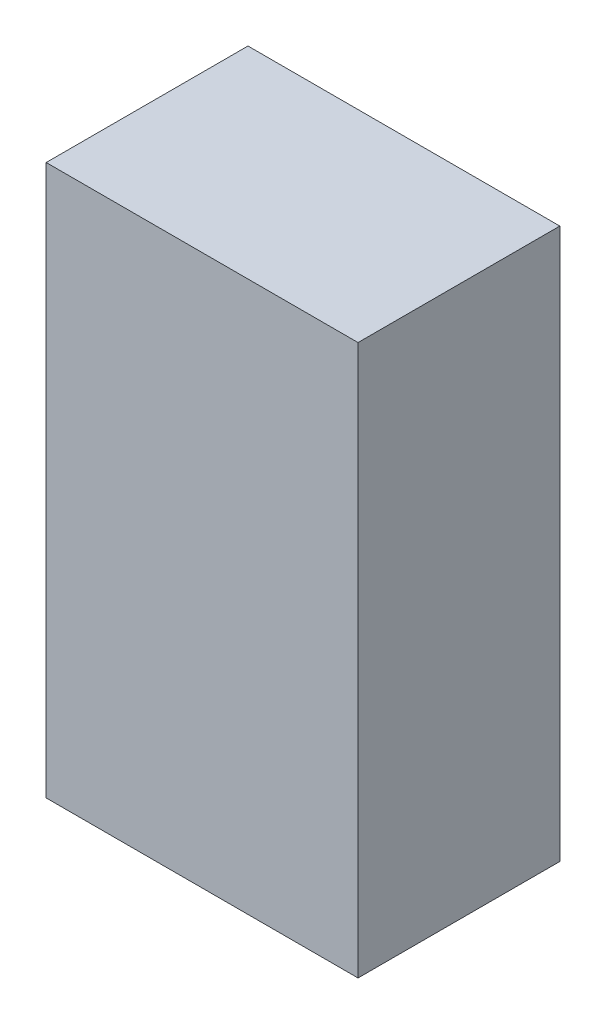
ISO-10303-21;
HEADER;
FILE_DESCRIPTION(('STEP AP214'),'2;1');
FILE_NAME('part.step','',(''),(''),'','','');
FILE_SCHEMA(('AUTOMOTIVE_DESIGN { 1 0 10303 214 1 1 1 1 }'));
ENDSEC;
DATA;
#1=APPLICATION_CONTEXT('core data for automotive mechanical design processes');
#2=APPLICATION_PROTOCOL_DEFINITION('international standard','automotive_design',2000,#1);
#3=PRODUCT_CONTEXT('',#1,'mechanical');
#4=PRODUCT('Part','Part','',(#3));
#5=PRODUCT_RELATED_PRODUCT_CATEGORY('part','',(#4));
#6=PRODUCT_DEFINITION_FORMATION('','',#4);
#7=PRODUCT_DEFINITION_CONTEXT('part definition',#1,'design');
#8=PRODUCT_DEFINITION('design','',#6,#7);
#9=PRODUCT_DEFINITION_SHAPE('','',#8);
#10=(LENGTH_UNIT() NAMED_UNIT(*) SI_UNIT(.MILLI.,.METRE.));
#11=(NAMED_UNIT(*) PLANE_ANGLE_UNIT() SI_UNIT($,.RADIAN.));
#12=(NAMED_UNIT(*) SI_UNIT($,.STERADIAN.) SOLID_ANGLE_UNIT());
#13=UNCERTAINTY_MEASURE_WITH_UNIT(LENGTH_MEASURE(1.E-05),#10,'distance_accuracy_value','');
#14=(GEOMETRIC_REPRESENTATION_CONTEXT(3) GLOBAL_UNCERTAINTY_ASSIGNED_CONTEXT((#13)) GLOBAL_UNIT_ASSIGNED_CONTEXT((#10,
#11,#12)) REPRESENTATION_CONTEXT('',''));
#15=CARTESIAN_POINT('',(0.,0.,0.));
#16=DIRECTION('',(0.,0.,1.));
#17=DIRECTION('',(1.,0.,0.));
#18=AXIS2_PLACEMENT_3D('',#15,#16,#17);
#19=CARTESIAN_POINT('',(0.85000084,-1.49999954,1.1));
#20=DIRECTION('',(0.,0.,1.));
#21=DIRECTION('',(1.,0.,0.));
#22=AXIS2_PLACEMENT_3D('',#19,#20,#21);
#23=PLANE('',#22);
#24=DIRECTION('',(1.,0.,0.));
#25=VECTOR('',#24,1.);
#26=CARTESIAN_POINT('',(-0.85000084,1.49999954,1.1));
#27=LINE('',#26,#25);
#28=CARTESIAN_POINT('',(-0.85000084,1.49999954,1.1));
#29=VERTEX_POINT('',#28);
#30=CARTESIAN_POINT('',(0.85000084,1.49999954,1.1));
#31=VERTEX_POINT('',#30);
#32=EDGE_CURVE('E58',#29,#31,#27,.T.);
#33=ORIENTED_EDGE('',*,*,#32,.F.);
#34=DIRECTION('',(0.,1.,0.));
#35=VECTOR('',#34,1.);
#36=CARTESIAN_POINT('',(-0.85000084,-1.49999954,1.1));
#37=LINE('',#36,#35);
#38=CARTESIAN_POINT('',(-0.85000084,-1.49999954,1.1));
#39=VERTEX_POINT('',#38);
#40=EDGE_CURVE('E53',#39,#29,#37,.T.);
#41=ORIENTED_EDGE('',*,*,#40,.F.);
#42=DIRECTION('',(1.,0.,0.));
#43=VECTOR('',#42,1.);
#44=CARTESIAN_POINT('',(0.85000084,-1.49999954,1.1));
#45=LINE('',#44,#43);
#46=CARTESIAN_POINT('',(0.85000084,-1.49999954,1.1));
#47=VERTEX_POINT('',#46);
#48=EDGE_CURVE('E20',#39,#47,#45,.T.);
#49=ORIENTED_EDGE('',*,*,#48,.T.);
#50=DIRECTION('',(0.,1.,0.));
#51=VECTOR('',#50,1.);
#52=CARTESIAN_POINT('',(0.85000084,1.49999954,1.1));
#53=LINE('',#52,#51);
#54=EDGE_CURVE('E67',#31,#47,#53,.F.);
#55=ORIENTED_EDGE('',*,*,#54,.F.);
#56=EDGE_LOOP('',(#33,#41,#49,#55));
#57=FACE_BOUND('',#56,.T.);
#58=ADVANCED_FACE('F17',(#57),#23,.T.);
#59=CARTESIAN_POINT('',(0.85000084,1.49999954,0.));
#60=DIRECTION('',(1.,0.,0.));
#61=DIRECTION('',(0.,0.,-1.));
#62=AXIS2_PLACEMENT_3D('',#59,#60,#61);
#63=PLANE('',#62);
#64=DIRECTION('',(0.,0.,-1.));
#65=VECTOR('',#64,1.);
#66=CARTESIAN_POINT('',(0.85000084,-1.49999954,0.));
#67=LINE('',#66,#65);
#68=CARTESIAN_POINT('',(0.85000084,-1.49999954,0.));
#69=VERTEX_POINT('',#68);
#70=EDGE_CURVE('E80',#69,#47,#67,.F.);
#71=ORIENTED_EDGE('',*,*,#70,.F.);
#72=DIRECTION('',(0.,1.,0.));
#73=VECTOR('',#72,1.);
#74=CARTESIAN_POINT('',(0.85000084,-1.49999954,0.));
#75=LINE('',#74,#73);
#76=CARTESIAN_POINT('',(0.85000084,1.49999954,0.));
#77=VERTEX_POINT('',#76);
#78=EDGE_CURVE('E75',#69,#77,#75,.T.);
#79=ORIENTED_EDGE('',*,*,#78,.T.);
#80=DIRECTION('',(0.,0.,1.));
#81=VECTOR('',#80,1.);
#82=CARTESIAN_POINT('',(0.85000084,1.49999954,0.));
#83=LINE('',#82,#81);
#84=EDGE_CURVE('E63',#31,#77,#83,.F.);
#85=ORIENTED_EDGE('',*,*,#84,.F.);
#86=ORIENTED_EDGE('',*,*,#54,.T.);
#87=EDGE_LOOP('',(#71,#79,#85,#86));
#88=FACE_BOUND('',#87,.T.);
#89=ADVANCED_FACE('F74',(#88),#63,.T.);
#90=CARTESIAN_POINT('',(-0.85000084,1.49999954,0.));
#91=DIRECTION('',(0.,1.,0.));
#92=DIRECTION('',(0.,0.,1.));
#93=AXIS2_PLACEMENT_3D('',#90,#91,#92);
#94=PLANE('',#93);
#95=ORIENTED_EDGE('',*,*,#84,.T.);
#96=DIRECTION('',(1.,0.,0.));
#97=VECTOR('',#96,1.);
#98=CARTESIAN_POINT('',(0.85000084,1.49999954,0.));
#99=LINE('',#98,#97);
#100=CARTESIAN_POINT('',(-0.85000084,1.49999954,0.));
#101=VERTEX_POINT('',#100);
#102=EDGE_CURVE('E84',#77,#101,#99,.F.);
#103=ORIENTED_EDGE('',*,*,#102,.T.);
#104=DIRECTION('',(0.,0.,1.));
#105=VECTOR('',#104,1.);
#106=CARTESIAN_POINT('',(-0.85000084,1.49999954,0.));
#107=LINE('',#106,#105);
#108=EDGE_CURVE('E65',#29,#101,#107,.F.);
#109=ORIENTED_EDGE('',*,*,#108,.F.);
#110=ORIENTED_EDGE('',*,*,#32,.T.);
#111=EDGE_LOOP('',(#95,#103,#109,#110));
#112=FACE_BOUND('',#111,.T.);
#113=ADVANCED_FACE('F60',(#112),#94,.T.);
#114=CARTESIAN_POINT('',(-0.85000084,-1.49999954,0.));
#115=DIRECTION('',(-1.,0.,0.));
#116=DIRECTION('',(0.,0.,1.));
#117=AXIS2_PLACEMENT_3D('',#114,#115,#116);
#118=PLANE('',#117);
#119=ORIENTED_EDGE('',*,*,#108,.T.);
#120=DIRECTION('',(0.,1.,0.));
#121=VECTOR('',#120,1.);
#122=CARTESIAN_POINT('',(-0.85000084,-1.49999954,0.));
#123=LINE('',#122,#121);
#124=CARTESIAN_POINT('',(-0.85000084,-1.49999954,0.));
#125=VERTEX_POINT('',#124);
#126=EDGE_CURVE('E26',#101,#125,#123,.F.);
#127=ORIENTED_EDGE('',*,*,#126,.T.);
#128=DIRECTION('',(0.,0.,-1.));
#129=VECTOR('',#128,1.);
#130=CARTESIAN_POINT('',(-0.85000084,-1.49999954,0.));
#131=LINE('',#130,#129);
#132=EDGE_CURVE('E34',#39,#125,#131,.T.);
#133=ORIENTED_EDGE('',*,*,#132,.F.);
#134=ORIENTED_EDGE('',*,*,#40,.T.);
#135=EDGE_LOOP('',(#119,#127,#133,#134));
#136=FACE_BOUND('',#135,.T.);
#137=ADVANCED_FACE('F88',(#136),#118,.T.);
#138=CARTESIAN_POINT('',(0.85000084,-1.49999954,0.));
#139=DIRECTION('',(0.,-1.,0.));
#140=DIRECTION('',(0.,0.,-1.));
#141=AXIS2_PLACEMENT_3D('',#138,#139,#140);
#142=PLANE('',#141);
#143=ORIENTED_EDGE('',*,*,#132,.T.);
#144=DIRECTION('',(1.,0.,0.));
#145=VECTOR('',#144,1.);
#146=CARTESIAN_POINT('',(0.85000084,-1.49999954,0.));
#147=LINE('',#146,#145);
#148=EDGE_CURVE('E11',#125,#69,#147,.T.);
#149=ORIENTED_EDGE('',*,*,#148,.T.);
#150=ORIENTED_EDGE('',*,*,#70,.T.);
#151=ORIENTED_EDGE('',*,*,#48,.F.);
#152=EDGE_LOOP('',(#143,#149,#150,#151));
#153=FACE_BOUND('',#152,.T.);
#154=ADVANCED_FACE('F91',(#153),#142,.T.);
#155=CARTESIAN_POINT('',(0.85000084,-1.49999954,0.));
#156=DIRECTION('',(0.,0.,1.));
#157=DIRECTION('',(1.,0.,0.));
#158=AXIS2_PLACEMENT_3D('',#155,#156,#157);
#159=PLANE('',#158);
#160=ORIENTED_EDGE('',*,*,#126,.F.);
#161=ORIENTED_EDGE('',*,*,#102,.F.);
#162=ORIENTED_EDGE('',*,*,#78,.F.);
#163=ORIENTED_EDGE('',*,*,#148,.F.);
#164=EDGE_LOOP('',(#160,#161,#162,#163));
#165=FACE_BOUND('',#164,.T.);
#166=ADVANCED_FACE('F90',(#165),#159,.F.);
#167=CLOSED_SHELL('',(#58,#89,#113,#137,#154,#166));
#168=MANIFOLD_SOLID_BREP('B1',#167);
#169=ADVANCED_BREP_SHAPE_REPRESENTATION('',(#18,#168),#14);
#170=SHAPE_DEFINITION_REPRESENTATION(#9,#169);
ENDSEC;
END-ISO-10303-21;
